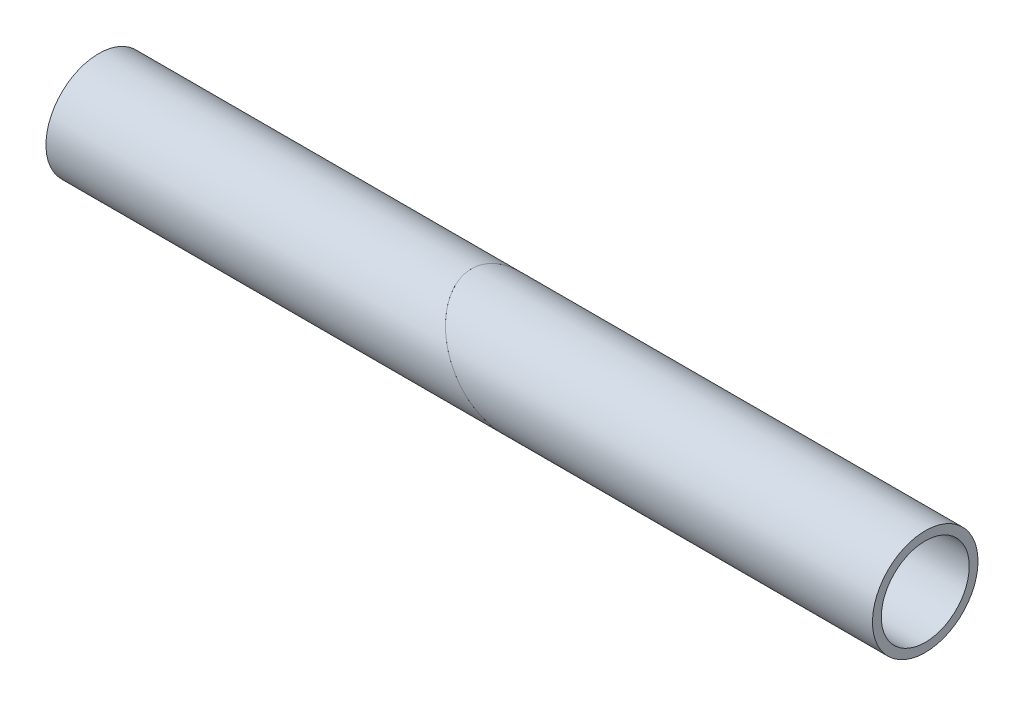
ISO-10303-21;
HEADER;
FILE_DESCRIPTION(('STEP AP214'),'2;1');
FILE_NAME('part.step','',(''),(''),'','','');
FILE_SCHEMA(('AUTOMOTIVE_DESIGN { 1 0 10303 214 1 1 1 1 }'));
ENDSEC;
DATA;
#1=APPLICATION_CONTEXT('core data for automotive mechanical design processes');
#2=APPLICATION_PROTOCOL_DEFINITION('international standard','automotive_design',2000,#1);
#3=PRODUCT_CONTEXT('',#1,'mechanical');
#4=PRODUCT('Part','Part','',(#3));
#5=PRODUCT_RELATED_PRODUCT_CATEGORY('part','',(#4));
#6=PRODUCT_DEFINITION_FORMATION('','',#4);
#7=PRODUCT_DEFINITION_CONTEXT('part definition',#1,'design');
#8=PRODUCT_DEFINITION('design','',#6,#7);
#9=PRODUCT_DEFINITION_SHAPE('','',#8);
#10=(LENGTH_UNIT() NAMED_UNIT(*) SI_UNIT(.MILLI.,.METRE.));
#11=(NAMED_UNIT(*) PLANE_ANGLE_UNIT() SI_UNIT($,.RADIAN.));
#12=(NAMED_UNIT(*) SI_UNIT($,.STERADIAN.) SOLID_ANGLE_UNIT());
#13=UNCERTAINTY_MEASURE_WITH_UNIT(LENGTH_MEASURE(1.E-05),#10,'distance_accuracy_value','');
#14=(GEOMETRIC_REPRESENTATION_CONTEXT(3) GLOBAL_UNCERTAINTY_ASSIGNED_CONTEXT((#13)) GLOBAL_UNIT_ASSIGNED_CONTEXT((#10,
#11,#12)) REPRESENTATION_CONTEXT('',''));
#15=CARTESIAN_POINT('',(0.,0.,0.));
#16=DIRECTION('',(0.,0.,1.));
#17=DIRECTION('',(1.,0.,0.));
#18=AXIS2_PLACEMENT_3D('',#15,#16,#17);
#19=CARTESIAN_POINT('',(221.147951580911,118.571948303779,211.145807105472));
#20=DIRECTION('',(1.,0.,0.));
#21=DIRECTION('',(0.,0.,-1.));
#22=AXIS2_PLACEMENT_3D('',#19,#20,#21);
#23=PLANE('',#22);
#24=DIRECTION('',(0.,0.,-1.));
#25=VECTOR('',#24,1.);
#26=CARTESIAN_POINT('',(221.147951580911,88.6235811530831,211.145807105472));
#27=LINE('',#26,#25);
#28=CARTESIAN_POINT('',(221.147951580911,88.623581153083,212.905154998053));
#29=VERTEX_POINT('',#28);
#30=CARTESIAN_POINT('',(221.147951580911,88.623581153083,209.386459212891));
#31=VERTEX_POINT('',#30);
#32=EDGE_CURVE('P0_E39',#29,#31,#27,.T.);
#33=ORIENTED_EDGE('',*,*,#32,.F.);
#34=CARTESIAN_POINT('',(221.147951580911,118.571948303779,211.145807105472));
#35=DIRECTION('',(1.,0.,0.));
#36=DIRECTION('',(0.,0.,-1.));
#37=AXIS2_PLACEMENT_3D('',#34,#35,#36);
#38=CIRCLE('',#37,30.);
#39=EDGE_CURVE('P0_E11',#29,#31,#38,.T.);
#40=ORIENTED_EDGE('',*,*,#39,.T.);
#41=EDGE_LOOP('',(#33,#40));
#42=FACE_BOUND('',#41,.T.);
#43=ADVANCED_FACE('P0_F17',(#42),#23,.T.);
#44=CARTESIAN_POINT('',(-36.8520484190889,118.571948303779,211.145807105472));
#45=DIRECTION('',(1.,0.,0.));
#46=DIRECTION('',(0.,0.,-1.));
#47=AXIS2_PLACEMENT_3D('',#44,#45,#46);
#48=PLANE('',#47);
#49=CARTESIAN_POINT('',(-36.8520484190889,118.571948303779,211.145807105472));
#50=DIRECTION('',(1.,0.,0.));
#51=DIRECTION('',(0.,0.,-1.));
#52=AXIS2_PLACEMENT_3D('',#49,#50,#51);
#53=CIRCLE('',#52,30.);
#54=CARTESIAN_POINT('',(-36.8520484190889,118.571948303779,181.145807105472));
#55=VERTEX_POINT('',#54);
#56=EDGE_CURVE('P0_E26',#55,#55,#53,.T.);
#57=ORIENTED_EDGE('',*,*,#56,.F.);
#58=EDGE_LOOP('',(#57));
#59=FACE_BOUND('',#58,.T.);
#60=CARTESIAN_POINT('',(-36.8520484190889,118.571948303779,211.145807105472));
#61=DIRECTION('',(1.,0.,0.));
#62=DIRECTION('',(0.,0.,-1.));
#63=AXIS2_PLACEMENT_3D('',#60,#61,#62);
#64=CIRCLE('',#63,25.);
#65=CARTESIAN_POINT('',(-36.8520484190889,118.571948303779,186.145807105472));
#66=VERTEX_POINT('',#65);
#67=EDGE_CURVE('P0_E42',#66,#66,#64,.T.);
#68=ORIENTED_EDGE('',*,*,#67,.T.);
#69=EDGE_LOOP('',(#68));
#70=FACE_BOUND('',#69,.T.);
#71=ADVANCED_FACE('P0_F47',(#59,#70),#48,.F.);
#72=CARTESIAN_POINT('',(221.147951580911,118.571948303779,211.145807105472));
#73=DIRECTION('',(-1.,0.,0.));
#74=DIRECTION('',(0.,0.,1.));
#75=AXIS2_PLACEMENT_3D('',#72,#73,#74);
#76=CYLINDRICAL_SURFACE('',#75,30.);
#77=CARTESIAN_POINT('',(198.16776122028,118.571948303779,211.145807105472));
#78=DIRECTION('',(-0.793353340291236,-0.608761429008719,0.));
#79=DIRECTION('',(-0.608761429008719,0.793353340291236,0.));
#80=AXIS2_PLACEMENT_3D('',#77,#78,#79);
#81=ELLIPSE('',#80,37.8141724203079,30.);
#82=EDGE_CURVE('P0_E33',#29,#31,#81,.T.);
#83=ORIENTED_EDGE('',*,*,#82,.T.);
#84=ORIENTED_EDGE('',*,*,#39,.F.);
#85=EDGE_LOOP('',(#83,#84));
#86=FACE_BOUND('',#85,.T.);
#87=ORIENTED_EDGE('',*,*,#56,.T.);
#88=EDGE_LOOP('',(#87));
#89=FACE_BOUND('',#88,.T.);
#90=ADVANCED_FACE('P0_F19',(#86,#89),#76,.T.);
#91=CARTESIAN_POINT('',(221.147951580911,118.571948303779,211.145807105472));
#92=DIRECTION('',(-1.,0.,0.));
#93=DIRECTION('',(0.,0.,1.));
#94=AXIS2_PLACEMENT_3D('',#91,#92,#93);
#95=CYLINDRICAL_SURFACE('',#94,25.);
#96=CARTESIAN_POINT('',(198.16776122028,118.571948303779,211.145807105472));
#97=DIRECTION('',(-0.793353340291236,-0.608761429008719,0.));
#98=DIRECTION('',(-0.608761429008719,0.793353340291236,0.));
#99=AXIS2_PLACEMENT_3D('',#96,#97,#98);
#100=ELLIPSE('',#99,31.5118103502566,25.);
#101=CARTESIAN_POINT('',(178.984586520806,143.571948303779,211.145807105472));
#102=VERTEX_POINT('',#101);
#103=EDGE_CURVE('P0_E21',#102,#102,#100,.T.);
#104=ORIENTED_EDGE('',*,*,#103,.F.);
#105=EDGE_LOOP('',(#104));
#106=FACE_BOUND('',#105,.T.);
#107=ORIENTED_EDGE('',*,*,#67,.F.);
#108=EDGE_LOOP('',(#107));
#109=FACE_BOUND('',#108,.T.);
#110=ADVANCED_FACE('P0_F46',(#106,#109),#95,.F.);
#111=CARTESIAN_POINT('',(175.147951580911,148.571948303779,82.1458071054723));
#112=DIRECTION('',(-0.793353340291236,-0.608761429008719,0.));
#113=DIRECTION('',(0.608761429008719,-0.793353340291236,0.));
#114=AXIS2_PLACEMENT_3D('',#111,#112,#113);
#115=PLANE('',#114);
#116=ORIENTED_EDGE('',*,*,#32,.T.);
#117=ORIENTED_EDGE('',*,*,#82,.F.);
#118=EDGE_LOOP('',(#116,#117));
#119=FACE_BOUND('',#118,.T.);
#120=ORIENTED_EDGE('',*,*,#103,.T.);
#121=EDGE_LOOP('',(#120));
#122=FACE_BOUND('',#121,.T.);
#123=ADVANCED_FACE('P0_F37',(#119,#122),#115,.F.);
#124=CLOSED_SHELL('',(#43,#71,#90,#110,#123));
#125=MANIFOLD_SOLID_BREP('P0_B1',#124);
#126=CARTESIAN_POINT('',(175.187570859649,118.571948303779,211.145807105472));
#127=DIRECTION('',(-1.,0.,0.));
#128=DIRECTION('',(0.,0.,-1.));
#129=AXIS2_PLACEMENT_3D('',#126,#127,#128);
#130=PLANE('',#129);
#131=DIRECTION('',(0.,0.,-1.));
#132=VECTOR('',#131,1.);
#133=CARTESIAN_POINT('',(175.187570859649,148.520315454474,211.145807105472));
#134=LINE('',#133,#132);
#135=CARTESIAN_POINT('',(175.187570859649,148.520315454474,212.905154998053));
#136=VERTEX_POINT('',#135);
#137=CARTESIAN_POINT('',(175.187570859649,148.520315454474,209.386459212891));
#138=VERTEX_POINT('',#137);
#139=EDGE_CURVE('P1_E38',#136,#138,#134,.T.);
#140=ORIENTED_EDGE('',*,*,#139,.F.);
#141=CARTESIAN_POINT('',(175.187570859649,118.571948303779,211.145807105472));
#142=DIRECTION('',(-1.,0.,0.));
#143=DIRECTION('',(0.,0.,-1.));
#144=AXIS2_PLACEMENT_3D('',#141,#142,#143);
#145=CIRCLE('',#144,30.);
#146=EDGE_CURVE('P1_E10',#136,#138,#145,.T.);
#147=ORIENTED_EDGE('',*,*,#146,.T.);
#148=EDGE_LOOP('',(#140,#147));
#149=FACE_BOUND('',#148,.T.);
#150=ADVANCED_FACE('P1_F16',(#149),#130,.T.);
#151=CARTESIAN_POINT('',(433.187570859649,118.571948303779,211.145807105472));
#152=DIRECTION('',(-1.,0.,0.));
#153=DIRECTION('',(0.,0.,-1.));
#154=AXIS2_PLACEMENT_3D('',#151,#152,#153);
#155=PLANE('',#154);
#156=CARTESIAN_POINT('',(433.187570859649,118.571948303779,211.145807105472));
#157=DIRECTION('',(-1.,0.,0.));
#158=DIRECTION('',(0.,0.,-1.));
#159=AXIS2_PLACEMENT_3D('',#156,#157,#158);
#160=CIRCLE('',#159,30.);
#161=CARTESIAN_POINT('',(433.187570859649,118.571948303779,181.145807105472));
#162=VERTEX_POINT('',#161);
#163=EDGE_CURVE('P1_E25',#162,#162,#160,.T.);
#164=ORIENTED_EDGE('',*,*,#163,.F.);
#165=EDGE_LOOP('',(#164));
#166=FACE_BOUND('',#165,.T.);
#167=CARTESIAN_POINT('',(433.187570859649,118.571948303779,211.145807105472));
#168=DIRECTION('',(-1.,0.,0.));
#169=DIRECTION('',(0.,0.,-1.));
#170=AXIS2_PLACEMENT_3D('',#167,#168,#169);
#171=CIRCLE('',#170,25.);
#172=CARTESIAN_POINT('',(433.187570859649,118.571948303779,186.145807105472));
#173=VERTEX_POINT('',#172);
#174=EDGE_CURVE('P1_E41',#173,#173,#171,.T.);
#175=ORIENTED_EDGE('',*,*,#174,.T.);
#176=EDGE_LOOP('',(#175));
#177=FACE_BOUND('',#176,.T.);
#178=ADVANCED_FACE('P1_F46',(#166,#177),#155,.F.);
#179=CARTESIAN_POINT('',(175.187570859649,118.571948303779,211.145807105472));
#180=DIRECTION('',(1.,0.,0.));
#181=DIRECTION('',(0.,0.,1.));
#182=AXIS2_PLACEMENT_3D('',#179,#180,#181);
#183=CYLINDRICAL_SURFACE('',#182,30.);
#184=CARTESIAN_POINT('',(198.16776122028,118.571948303779,211.145807105472));
#185=DIRECTION('',(0.793353340291236,0.608761429008719,0.));
#186=DIRECTION('',(0.608761429008719,-0.793353340291236,0.));
#187=AXIS2_PLACEMENT_3D('',#184,#185,#186);
#188=ELLIPSE('',#187,37.8141724203079,30.);
#189=EDGE_CURVE('P1_E32',#136,#138,#188,.T.);
#190=ORIENTED_EDGE('',*,*,#189,.T.);
#191=ORIENTED_EDGE('',*,*,#146,.F.);
#192=EDGE_LOOP('',(#190,#191));
#193=FACE_BOUND('',#192,.T.);
#194=ORIENTED_EDGE('',*,*,#163,.T.);
#195=EDGE_LOOP('',(#194));
#196=FACE_BOUND('',#195,.T.);
#197=ADVANCED_FACE('P1_F18',(#193,#196),#183,.T.);
#198=CARTESIAN_POINT('',(175.187570859649,118.571948303779,211.145807105472));
#199=DIRECTION('',(1.,0.,0.));
#200=DIRECTION('',(0.,0.,1.));
#201=AXIS2_PLACEMENT_3D('',#198,#199,#200);
#202=CYLINDRICAL_SURFACE('',#201,25.);
#203=CARTESIAN_POINT('',(198.16776122028,118.571948303779,211.145807105472));
#204=DIRECTION('',(0.793353340291236,0.608761429008719,0.));
#205=DIRECTION('',(0.608761429008719,-0.793353340291236,0.));
#206=AXIS2_PLACEMENT_3D('',#203,#204,#205);
#207=ELLIPSE('',#206,31.5118103502566,25.);
#208=CARTESIAN_POINT('',(217.350935919754,93.5719483037787,211.145807105472));
#209=VERTEX_POINT('',#208);
#210=EDGE_CURVE('P1_E20',#209,#209,#207,.T.);
#211=ORIENTED_EDGE('',*,*,#210,.F.);
#212=EDGE_LOOP('',(#211));
#213=FACE_BOUND('',#212,.T.);
#214=ORIENTED_EDGE('',*,*,#174,.F.);
#215=EDGE_LOOP('',(#214));
#216=FACE_BOUND('',#215,.T.);
#217=ADVANCED_FACE('P1_F45',(#213,#216),#202,.F.);
#218=CARTESIAN_POINT('',(221.187570859649,88.5719483037788,82.1458071054723));
#219=DIRECTION('',(0.793353340291236,0.608761429008719,0.));
#220=DIRECTION('',(-0.608761429008719,0.793353340291236,0.));
#221=AXIS2_PLACEMENT_3D('',#218,#219,#220);
#222=PLANE('',#221);
#223=ORIENTED_EDGE('',*,*,#139,.T.);
#224=ORIENTED_EDGE('',*,*,#189,.F.);
#225=EDGE_LOOP('',(#223,#224));
#226=FACE_BOUND('',#225,.T.);
#227=ORIENTED_EDGE('',*,*,#210,.T.);
#228=EDGE_LOOP('',(#227));
#229=FACE_BOUND('',#228,.T.);
#230=ADVANCED_FACE('P1_F36',(#226,#229),#222,.F.);
#231=CLOSED_SHELL('',(#150,#178,#197,#217,#230));
#232=MANIFOLD_SOLID_BREP('P1_B1',#231);
#233=ADVANCED_BREP_SHAPE_REPRESENTATION('',(#18,#125,#232),#14);
#234=SHAPE_DEFINITION_REPRESENTATION(#9,#233);
ENDSEC;
END-ISO-10303-21;
